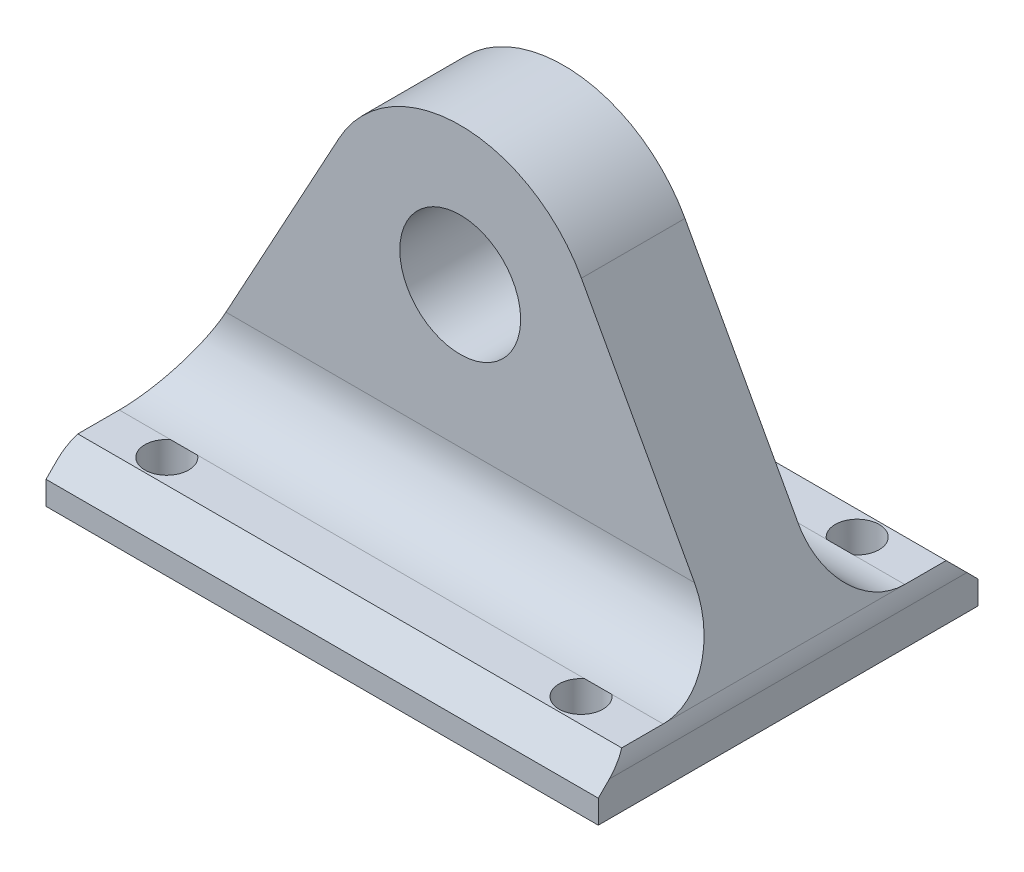
ISO-10303-21;
HEADER;
FILE_DESCRIPTION(('STEP AP214'),'2;1');
FILE_NAME('part.step','',(''),(''),'','','');
FILE_SCHEMA(('AUTOMOTIVE_DESIGN { 1 0 10303 214 1 1 1 1 }'));
ENDSEC;
DATA;
#1=APPLICATION_CONTEXT('core data for automotive mechanical design processes');
#2=APPLICATION_PROTOCOL_DEFINITION('international standard','automotive_design',2000,#1);
#3=PRODUCT_CONTEXT('',#1,'mechanical');
#4=PRODUCT('Part','Part','',(#3));
#5=PRODUCT_RELATED_PRODUCT_CATEGORY('part','',(#4));
#6=PRODUCT_DEFINITION_FORMATION('','',#4);
#7=PRODUCT_DEFINITION_CONTEXT('part definition',#1,'design');
#8=PRODUCT_DEFINITION('design','',#6,#7);
#9=PRODUCT_DEFINITION_SHAPE('','',#8);
#10=(LENGTH_UNIT() NAMED_UNIT(*) SI_UNIT(.MILLI.,.METRE.));
#11=(NAMED_UNIT(*) PLANE_ANGLE_UNIT() SI_UNIT($,.RADIAN.));
#12=(NAMED_UNIT(*) SI_UNIT($,.STERADIAN.) SOLID_ANGLE_UNIT());
#13=UNCERTAINTY_MEASURE_WITH_UNIT(LENGTH_MEASURE(1.E-05),#10,'distance_accuracy_value','');
#14=(GEOMETRIC_REPRESENTATION_CONTEXT(3) GLOBAL_UNCERTAINTY_ASSIGNED_CONTEXT((#13)) GLOBAL_UNIT_ASSIGNED_CONTEXT((#10,
#11,#12)) REPRESENTATION_CONTEXT('',''));
#15=CARTESIAN_POINT('',(0.,0.,0.));
#16=DIRECTION('',(0.,0.,1.));
#17=DIRECTION('',(1.,0.,0.));
#18=AXIS2_PLACEMENT_3D('',#15,#16,#17);
#19=CARTESIAN_POINT('',(47.23686332674,1.52118959964613,-12.7));
#20=DIRECTION('',(0.,-1.,0.));
#21=DIRECTION('',(1.,0.,0.));
#22=AXIS2_PLACEMENT_3D('',#19,#20,#21);
#23=PLANE('',#22);
#24=CARTESIAN_POINT('',(3.175,1.52118959964613,-7.93749999999999));
#25=DIRECTION('',(0.,1.,0.));
#26=DIRECTION('',(0.,0.,1.));
#27=AXIS2_PLACEMENT_3D('',#24,#25,#26);
#28=CIRCLE('',#27,2.0193);
#29=CARTESIAN_POINT('',(4.42296483924829,1.52118959964613,-6.35));
#30=VERTEX_POINT('',#29);
#31=CARTESIAN_POINT('',(1.9270351607517,1.52118959964613,-6.35));
#32=VERTEX_POINT('',#31);
#33=EDGE_CURVE('E60',#30,#32,#28,.T.);
#34=ORIENTED_EDGE('',*,*,#33,.F.);
#35=DIRECTION('',(1.,0.,0.));
#36=VECTOR('',#35,1.);
#37=CARTESIAN_POINT('',(47.23686332674,1.52118959964613,-6.35));
#38=LINE('',#37,#36);
#39=CARTESIAN_POINT('',(40.0270351607517,1.52118959964613,-6.35));
#40=VERTEX_POINT('',#39);
#41=EDGE_CURVE('E70',#30,#40,#38,.T.);
#42=ORIENTED_EDGE('',*,*,#41,.T.);
#43=CARTESIAN_POINT('',(41.275,1.52118959964613,-7.93749999999999));
#44=DIRECTION('',(0.,1.,0.));
#45=DIRECTION('',(0.,0.,1.));
#46=AXIS2_PLACEMENT_3D('',#43,#44,#45);
#47=CIRCLE('',#46,2.0193);
#48=CARTESIAN_POINT('',(42.5229648392483,1.52118959964613,-6.35));
#49=VERTEX_POINT('',#48);
#50=EDGE_CURVE('E386',#49,#40,#47,.T.);
#51=ORIENTED_EDGE('',*,*,#50,.F.);
#52=CARTESIAN_POINT('',(47.23686332674,1.52118959964613,-6.34999999999999));
#53=VERTEX_POINT('',#52);
#54=EDGE_CURVE('E214',#49,#53,#38,.T.);
#55=ORIENTED_EDGE('',*,*,#54,.T.);
#56=DIRECTION('',(0.,0.,1.));
#57=VECTOR('',#56,1.);
#58=CARTESIAN_POINT('',(47.23686332674,1.52118959964613,-12.7));
#59=LINE('',#58,#57);
#60=CARTESIAN_POINT('',(47.23686332674,1.52118959964613,-10.16));
#61=VERTEX_POINT('',#60);
#62=EDGE_CURVE('E384',#61,#53,#59,.T.);
#63=ORIENTED_EDGE('',*,*,#62,.F.);
#64=DIRECTION('',(-1.,0.,0.));
#65=VECTOR('',#64,1.);
#66=CARTESIAN_POINT('',(-2.78686332674002,1.52118959964613,-10.16));
#67=LINE('',#66,#65);
#68=CARTESIAN_POINT('',(-2.78686332674002,1.52118959964613,-10.16));
#69=VERTEX_POINT('',#68);
#70=EDGE_CURVE('E368',#61,#69,#67,.T.);
#71=ORIENTED_EDGE('',*,*,#70,.T.);
#72=DIRECTION('',(0.,0.,1.));
#73=VECTOR('',#72,1.);
#74=CARTESIAN_POINT('',(-2.78686332674002,1.52118959964613,-12.7));
#75=LINE('',#74,#73);
#76=CARTESIAN_POINT('',(-2.78686332674002,1.52118959964613,-6.35));
#77=VERTEX_POINT('',#76);
#78=EDGE_CURVE('E392',#69,#77,#75,.T.);
#79=ORIENTED_EDGE('',*,*,#78,.T.);
#80=EDGE_CURVE('E212',#77,#32,#38,.T.);
#81=ORIENTED_EDGE('',*,*,#80,.T.);
#82=EDGE_LOOP('',(#34,#42,#51,#55,#63,#71,#79,#81));
#83=FACE_BOUND('',#82,.T.);
#84=ADVANCED_FACE('F42',(#83),#23,.F.);
#85=CARTESIAN_POINT('',(-2.78686332674002,1.52118959964613,22.225));
#86=DIRECTION('',(0.,-1.,0.));
#87=DIRECTION('',(1.,0.,0.));
#88=AXIS2_PLACEMENT_3D('',#85,#86,#87);
#89=PLANE('',#88);
#90=DIRECTION('',(-1.,0.,0.));
#91=VECTOR('',#90,1.);
#92=CARTESIAN_POINT('',(-2.78686332674002,1.52118959964613,15.875));
#93=LINE('',#92,#91);
#94=CARTESIAN_POINT('',(47.23686332674,1.52118959964613,15.875));
#95=VERTEX_POINT('',#94);
#96=CARTESIAN_POINT('',(42.5229648392483,1.52118959964613,15.875));
#97=VERTEX_POINT('',#96);
#98=EDGE_CURVE('E248',#95,#97,#93,.T.);
#99=ORIENTED_EDGE('',*,*,#98,.T.);
#100=CARTESIAN_POINT('',(41.275,1.52118959964613,17.4625));
#101=DIRECTION('',(0.,1.,0.));
#102=DIRECTION('',(0.,0.,1.));
#103=AXIS2_PLACEMENT_3D('',#100,#101,#102);
#104=CIRCLE('',#103,2.0193);
#105=CARTESIAN_POINT('',(40.0270351607517,1.52118959964613,15.875));
#106=VERTEX_POINT('',#105);
#107=EDGE_CURVE('E499',#106,#97,#104,.T.);
#108=ORIENTED_EDGE('',*,*,#107,.F.);
#109=CARTESIAN_POINT('',(4.42296483924828,1.52118959964613,15.875));
#110=VERTEX_POINT('',#109);
#111=EDGE_CURVE('E253',#106,#110,#93,.T.);
#112=ORIENTED_EDGE('',*,*,#111,.T.);
#113=CARTESIAN_POINT('',(3.175,1.52118959964613,17.4625));
#114=DIRECTION('',(0.,1.,0.));
#115=DIRECTION('',(0.,0.,1.));
#116=AXIS2_PLACEMENT_3D('',#113,#114,#115);
#117=CIRCLE('',#116,2.0193);
#118=CARTESIAN_POINT('',(1.92703516075172,1.52118959964613,15.875));
#119=VERTEX_POINT('',#118);
#120=EDGE_CURVE('E508',#119,#110,#117,.T.);
#121=ORIENTED_EDGE('',*,*,#120,.F.);
#122=CARTESIAN_POINT('',(-2.78686332674002,1.52118959964613,15.875));
#123=VERTEX_POINT('',#122);
#124=EDGE_CURVE('E237',#119,#123,#93,.T.);
#125=ORIENTED_EDGE('',*,*,#124,.T.);
#126=DIRECTION('',(0.,0.,-1.));
#127=VECTOR('',#126,1.);
#128=CARTESIAN_POINT('',(-2.78686332674002,1.52118959964613,22.225));
#129=LINE('',#128,#127);
#130=CARTESIAN_POINT('',(-2.78686332674002,1.52118959964613,19.685));
#131=VERTEX_POINT('',#130);
#132=EDGE_CURVE('E411',#131,#123,#129,.T.);
#133=ORIENTED_EDGE('',*,*,#132,.F.);
#134=DIRECTION('',(1.,0.,0.));
#135=VECTOR('',#134,1.);
#136=CARTESIAN_POINT('',(47.23686332674,1.52118959964613,19.685));
#137=LINE('',#136,#135);
#138=CARTESIAN_POINT('',(47.23686332674,1.52118959964613,19.685));
#139=VERTEX_POINT('',#138);
#140=EDGE_CURVE('E349',#131,#139,#137,.T.);
#141=ORIENTED_EDGE('',*,*,#140,.T.);
#142=DIRECTION('',(0.,0.,-1.));
#143=VECTOR('',#142,1.);
#144=CARTESIAN_POINT('',(47.23686332674,1.52118959964613,22.225));
#145=LINE('',#144,#143);
#146=EDGE_CURVE('E414',#139,#95,#145,.T.);
#147=ORIENTED_EDGE('',*,*,#146,.T.);
#148=EDGE_LOOP('',(#99,#108,#112,#121,#125,#133,#141,#147));
#149=FACE_BOUND('',#148,.T.);
#150=ADVANCED_FACE('F443',(#149),#89,.F.);
#151=CARTESIAN_POINT('',(44.45,0.,0.));
#152=DIRECTION('',(0.,0.,1.));
#153=DIRECTION('',(1.,0.,0.));
#154=AXIS2_PLACEMENT_3D('',#151,#152,#153);
#155=PLANE('',#154);
#156=CARTESIAN_POINT('',(22.225,20.8364312010616,0.));
#157=DIRECTION('',(0.,0.,1.));
#158=DIRECTION('',(1.,0.,0.));
#159=AXIS2_PLACEMENT_3D('',#156,#157,#158);
#160=CIRCLE('',#159,5.55625);
#161=CARTESIAN_POINT('',(16.66875,20.8364312010616,0.));
#162=VERTEX_POINT('',#161);
#163=EDGE_CURVE('E309',#162,#162,#160,.T.);
#164=ORIENTED_EDGE('',*,*,#163,.T.);
#165=EDGE_LOOP('',(#164));
#166=FACE_BOUND('',#165,.T.);
#167=DIRECTION('',(-0.479114834534213,0.877752228894495,0.));
#168=VECTOR('',#167,1.);
#169=CARTESIAN_POINT('',(33.3724533069601,26.9211895996461,0.));
#170=LINE('',#169,#168);
#171=CARTESIAN_POINT('',(43.770760821795,7.87118959964613,0.));
#172=VERTEX_POINT('',#171);
#173=CARTESIAN_POINT('',(33.3724533069601,26.9211895996461,0.));
#174=VERTEX_POINT('',#173);
#175=EDGE_CURVE('E312',#172,#174,#170,.T.);
#176=ORIENTED_EDGE('',*,*,#175,.F.);
#177=DIRECTION('',(1.,0.,0.));
#178=VECTOR('',#177,1.);
#179=CARTESIAN_POINT('',(-2.78686332674002,7.87118959964612,0.));
#180=LINE('',#179,#178);
#181=CARTESIAN_POINT('',(0.679239178204961,7.87118959964612,0.));
#182=VERTEX_POINT('',#181);
#183=EDGE_CURVE('E233',#172,#182,#180,.F.);
#184=ORIENTED_EDGE('',*,*,#183,.T.);
#185=DIRECTION('',(-0.479114834534213,-0.877752228894495,0.));
#186=VECTOR('',#185,1.);
#187=CARTESIAN_POINT('',(-2.78686332674002,1.52118959964613,0.));
#188=LINE('',#187,#186);
#189=CARTESIAN_POINT('',(11.0775466930399,26.9211895996461,0.));
#190=VERTEX_POINT('',#189);
#191=EDGE_CURVE('E300',#190,#182,#188,.T.);
#192=ORIENTED_EDGE('',*,*,#191,.F.);
#193=CARTESIAN_POINT('',(22.225,20.8364312010616,0.));
#194=DIRECTION('',(0.,0.,1.));
#195=DIRECTION('',(1.,0.,0.));
#196=AXIS2_PLACEMENT_3D('',#193,#194,#195);
#197=CIRCLE('',#196,12.7);
#198=EDGE_CURVE('E306',#174,#190,#197,.T.);
#199=ORIENTED_EDGE('',*,*,#198,.F.);
#200=EDGE_LOOP('',(#176,#184,#192,#199));
#201=FACE_BOUND('',#200,.T.);
#202=ADVANCED_FACE('F423',(#166,#201),#155,.F.);
#203=CARTESIAN_POINT('',(44.45,0.,9.525));
#204=DIRECTION('',(0.,0.,1.));
#205=DIRECTION('',(1.,0.,0.));
#206=AXIS2_PLACEMENT_3D('',#203,#204,#205);
#207=PLANE('',#206);
#208=DIRECTION('',(-0.479114834534213,-0.877752228894495,0.));
#209=VECTOR('',#208,1.);
#210=CARTESIAN_POINT('',(-2.78686332674002,1.52118959964613,9.525));
#211=LINE('',#210,#209);
#212=CARTESIAN_POINT('',(11.0775466930399,26.9211895996461,9.525));
#213=VERTEX_POINT('',#212);
#214=CARTESIAN_POINT('',(0.679239178204961,7.87118959964612,9.525));
#215=VERTEX_POINT('',#214);
#216=EDGE_CURVE('E271',#213,#215,#211,.T.);
#217=ORIENTED_EDGE('',*,*,#216,.T.);
#218=DIRECTION('',(-1.,0.,0.));
#219=VECTOR('',#218,1.);
#220=CARTESIAN_POINT('',(44.45,7.87118959964612,9.525));
#221=LINE('',#220,#219);
#222=CARTESIAN_POINT('',(43.770760821795,7.87118959964613,9.525));
#223=VERTEX_POINT('',#222);
#224=EDGE_CURVE('E252',#215,#223,#221,.F.);
#225=ORIENTED_EDGE('',*,*,#224,.T.);
#226=DIRECTION('',(-0.479114834534213,0.877752228894495,0.));
#227=VECTOR('',#226,1.);
#228=CARTESIAN_POINT('',(33.3724533069601,26.9211895996461,9.525));
#229=LINE('',#228,#227);
#230=CARTESIAN_POINT('',(33.3724533069601,26.9211895996461,9.525));
#231=VERTEX_POINT('',#230);
#232=EDGE_CURVE('E296',#223,#231,#229,.T.);
#233=ORIENTED_EDGE('',*,*,#232,.T.);
#234=CARTESIAN_POINT('',(22.225,20.8364312010616,9.525));
#235=DIRECTION('',(0.,0.,1.));
#236=DIRECTION('',(1.,0.,0.));
#237=AXIS2_PLACEMENT_3D('',#234,#235,#236);
#238=CIRCLE('',#237,12.7);
#239=EDGE_CURVE('E282',#231,#213,#238,.T.);
#240=ORIENTED_EDGE('',*,*,#239,.T.);
#241=EDGE_LOOP('',(#217,#225,#233,#240));
#242=FACE_BOUND('',#241,.T.);
#243=CARTESIAN_POINT('',(22.225,20.8364312010616,9.525));
#244=DIRECTION('',(0.,0.,1.));
#245=DIRECTION('',(1.,0.,0.));
#246=AXIS2_PLACEMENT_3D('',#243,#244,#245);
#247=CIRCLE('',#246,5.55625);
#248=CARTESIAN_POINT('',(16.66875,20.8364312010616,9.525));
#249=VERTEX_POINT('',#248);
#250=EDGE_CURVE('E314',#249,#249,#247,.T.);
#251=ORIENTED_EDGE('',*,*,#250,.F.);
#252=EDGE_LOOP('',(#251));
#253=FACE_BOUND('',#252,.T.);
#254=ADVANCED_FACE('F278',(#242,#253),#207,.T.);
#255=CARTESIAN_POINT('',(44.45,0.,9.525));
#256=DIRECTION('',(0.,0.,-1.));
#257=DIRECTION('',(-1.,0.,0.));
#258=AXIS2_PLACEMENT_3D('',#255,#256,#257);
#259=CYLINDRICAL_SURFACE('',#258,3.175);
#260=DIRECTION('',(0.,0.,-1.));
#261=VECTOR('',#260,1.);
#262=CARTESIAN_POINT('',(47.625,0.,9.525));
#263=LINE('',#262,#261);
#264=CARTESIAN_POINT('',(47.625,0.,21.2061895996461));
#265=VERTEX_POINT('',#264);
#266=CARTESIAN_POINT('',(47.625,0.,-11.6811895996461));
#267=VERTEX_POINT('',#266);
#268=EDGE_CURVE('E285',#265,#267,#263,.T.);
#269=ORIENTED_EDGE('',*,*,#268,.T.);
#270=CARTESIAN_POINT('',(44.45,0.,-11.6811895996461));
#271=DIRECTION('',(0.,0.707106781186549,-0.707106781186546));
#272=DIRECTION('',(0.,-0.707106781186546,-0.707106781186549));
#273=AXIS2_PLACEMENT_3D('',#270,#271,#272);
#274=ELLIPSE('',#273,4.49012806053459,3.175);
#275=EDGE_CURVE('E365',#267,#61,#274,.F.);
#276=ORIENTED_EDGE('',*,*,#275,.T.);
#277=ORIENTED_EDGE('',*,*,#62,.T.);
#278=DIRECTION('',(0.,0.,-1.));
#279=VECTOR('',#278,1.);
#280=CARTESIAN_POINT('',(47.23686332674,1.52118959964613,9.525));
#281=LINE('',#280,#279);
#282=EDGE_CURVE('E293',#95,#53,#281,.T.);
#283=ORIENTED_EDGE('',*,*,#282,.F.);
#284=ORIENTED_EDGE('',*,*,#146,.F.);
#285=CARTESIAN_POINT('',(44.45,0.,21.2061895996461));
#286=DIRECTION('',(0.,0.707106781186549,0.707106781186546));
#287=DIRECTION('',(0.,0.707106781186546,-0.707106781186549));
#288=AXIS2_PLACEMENT_3D('',#285,#286,#287);
#289=ELLIPSE('',#288,4.49012806053459,3.175);
#290=EDGE_CURVE('E352',#139,#265,#289,.F.);
#291=ORIENTED_EDGE('',*,*,#290,.T.);
#292=EDGE_LOOP('',(#269,#276,#277,#283,#284,#291));
#293=FACE_BOUND('',#292,.T.);
#294=ADVANCED_FACE('F388',(#293),#259,.T.);
#295=CARTESIAN_POINT('',(33.3724533069601,26.9211895996461,9.525));
#296=DIRECTION('',(-0.877752228894495,-0.479114834534213,0.));
#297=DIRECTION('',(0.479114834534213,-0.877752228894495,0.));
#298=AXIS2_PLACEMENT_3D('',#295,#296,#297);
#299=PLANE('',#298);
#300=ORIENTED_EDGE('',*,*,#282,.T.);
#301=CARTESIAN_POINT('',(43.770760821795,7.87118959964612,-6.35));
#302=DIRECTION('',(-0.877752228894495,-0.479114834534213,0.));
#303=DIRECTION('',(-0.479114834534213,0.877752228894495,0.));
#304=AXIS2_PLACEMENT_3D('',#301,#302,#303);
#305=ELLIPSE('',#304,7.23438778161538,6.35);
#306=EDGE_CURVE('E256',#53,#172,#305,.T.);
#307=ORIENTED_EDGE('',*,*,#306,.T.);
#308=ORIENTED_EDGE('',*,*,#175,.T.);
#309=DIRECTION('',(0.,0.,-1.));
#310=VECTOR('',#309,1.);
#311=CARTESIAN_POINT('',(33.3724533069601,26.9211895996461,9.525));
#312=LINE('',#311,#310);
#313=EDGE_CURVE('E298',#231,#174,#312,.T.);
#314=ORIENTED_EDGE('',*,*,#313,.F.);
#315=ORIENTED_EDGE('',*,*,#232,.F.);
#316=CARTESIAN_POINT('',(43.770760821795,7.87118959964612,15.875));
#317=DIRECTION('',(-0.877752228894495,-0.479114834534213,0.));
#318=DIRECTION('',(-0.479114834534213,0.877752228894495,0.));
#319=AXIS2_PLACEMENT_3D('',#316,#317,#318);
#320=ELLIPSE('',#319,7.23438778161538,6.35);
#321=EDGE_CURVE('E11',#223,#95,#320,.T.);
#322=ORIENTED_EDGE('',*,*,#321,.T.);
#323=EDGE_LOOP('',(#300,#307,#308,#314,#315,#322));
#324=FACE_BOUND('',#323,.T.);
#325=ADVANCED_FACE('F292',(#324),#299,.F.);
#326=CARTESIAN_POINT('',(22.225,20.8364312010616,9.525));
#327=DIRECTION('',(0.,0.,-1.));
#328=DIRECTION('',(-1.,0.,0.));
#329=AXIS2_PLACEMENT_3D('',#326,#327,#328);
#330=CYLINDRICAL_SURFACE('',#329,12.7);
#331=ORIENTED_EDGE('',*,*,#198,.T.);
#332=DIRECTION('',(0.,0.,-1.));
#333=VECTOR('',#332,1.);
#334=CARTESIAN_POINT('',(11.0775466930399,26.9211895996461,9.525));
#335=LINE('',#334,#333);
#336=EDGE_CURVE('E332',#213,#190,#335,.T.);
#337=ORIENTED_EDGE('',*,*,#336,.F.);
#338=ORIENTED_EDGE('',*,*,#239,.F.);
#339=ORIENTED_EDGE('',*,*,#313,.T.);
#340=EDGE_LOOP('',(#331,#337,#338,#339));
#341=FACE_BOUND('',#340,.T.);
#342=ADVANCED_FACE('F548',(#341),#330,.T.);
#343=CARTESIAN_POINT('',(-2.78686332674002,1.52118959964613,9.525));
#344=DIRECTION('',(0.877752228894495,-0.479114834534213,0.));
#345=DIRECTION('',(0.479114834534213,0.877752228894495,0.));
#346=AXIS2_PLACEMENT_3D('',#343,#344,#345);
#347=PLANE('',#346);
#348=ORIENTED_EDGE('',*,*,#191,.T.);
#349=CARTESIAN_POINT('',(0.679239178204963,7.87118959964612,-6.35));
#350=DIRECTION('',(0.877752228894495,-0.479114834534213,0.));
#351=DIRECTION('',(-0.479114834534213,-0.877752228894495,0.));
#352=AXIS2_PLACEMENT_3D('',#349,#350,#351);
#353=ELLIPSE('',#352,7.23438778161538,6.35);
#354=EDGE_CURVE('E259',#182,#77,#353,.T.);
#355=ORIENTED_EDGE('',*,*,#354,.T.);
#356=DIRECTION('',(0.,0.,-1.));
#357=VECTOR('',#356,1.);
#358=CARTESIAN_POINT('',(-2.78686332674002,1.52118959964613,9.525));
#359=LINE('',#358,#357);
#360=EDGE_CURVE('E272',#123,#77,#359,.T.);
#361=ORIENTED_EDGE('',*,*,#360,.F.);
#362=CARTESIAN_POINT('',(0.679239178204961,7.87118959964612,15.875));
#363=DIRECTION('',(0.877752228894495,-0.479114834534213,0.));
#364=DIRECTION('',(-0.479114834534213,-0.877752228894495,0.));
#365=AXIS2_PLACEMENT_3D('',#362,#363,#364);
#366=ELLIPSE('',#365,7.23438778161538,6.35);
#367=EDGE_CURVE('E51',#123,#215,#366,.T.);
#368=ORIENTED_EDGE('',*,*,#367,.T.);
#369=ORIENTED_EDGE('',*,*,#216,.F.);
#370=ORIENTED_EDGE('',*,*,#336,.T.);
#371=EDGE_LOOP('',(#348,#355,#361,#368,#369,#370));
#372=FACE_BOUND('',#371,.T.);
#373=ADVANCED_FACE('F269',(#372),#347,.F.);
#374=CARTESIAN_POINT('',(0.,0.,9.525));
#375=DIRECTION('',(0.,0.,-1.));
#376=DIRECTION('',(-1.,0.,0.));
#377=AXIS2_PLACEMENT_3D('',#374,#375,#376);
#378=CYLINDRICAL_SURFACE('',#377,3.175);
#379=ORIENTED_EDGE('',*,*,#78,.F.);
#380=CARTESIAN_POINT('',(0.,0.,-11.6811895996461));
#381=DIRECTION('',(0.,0.707106781186549,-0.707106781186546));
#382=DIRECTION('',(0.,-0.707106781186546,-0.707106781186549));
#383=AXIS2_PLACEMENT_3D('',#380,#381,#382);
#384=ELLIPSE('',#383,4.49012806053459,3.175);
#385=CARTESIAN_POINT('',(-3.175,0.,-11.6811895996461));
#386=VERTEX_POINT('',#385);
#387=EDGE_CURVE('E371',#69,#386,#384,.F.);
#388=ORIENTED_EDGE('',*,*,#387,.T.);
#389=DIRECTION('',(0.,0.,-1.));
#390=VECTOR('',#389,1.);
#391=CARTESIAN_POINT('',(-3.175,0.,9.525));
#392=LINE('',#391,#390);
#393=CARTESIAN_POINT('',(-3.175,0.,21.2061895996461));
#394=VERTEX_POINT('',#393);
#395=EDGE_CURVE('E327',#394,#386,#392,.T.);
#396=ORIENTED_EDGE('',*,*,#395,.F.);
#397=CARTESIAN_POINT('',(0.,0.,21.2061895996461));
#398=DIRECTION('',(0.,0.707106781186549,0.707106781186546));
#399=DIRECTION('',(0.,0.707106781186546,-0.707106781186549));
#400=AXIS2_PLACEMENT_3D('',#397,#398,#399);
#401=ELLIPSE('',#400,4.49012806053459,3.175);
#402=EDGE_CURVE('E346',#394,#131,#401,.F.);
#403=ORIENTED_EDGE('',*,*,#402,.T.);
#404=ORIENTED_EDGE('',*,*,#132,.T.);
#405=ORIENTED_EDGE('',*,*,#360,.T.);
#406=EDGE_LOOP('',(#379,#388,#396,#403,#404,#405));
#407=FACE_BOUND('',#406,.T.);
#408=ADVANCED_FACE('F540',(#407),#378,.T.);
#409=CARTESIAN_POINT('',(-3.175,0.,9.525));
#410=DIRECTION('',(1.,0.,0.));
#411=DIRECTION('',(0.,1.,0.));
#412=AXIS2_PLACEMENT_3D('',#409,#410,#411);
#413=PLANE('',#412);
#414=ORIENTED_EDGE('',*,*,#395,.T.);
#415=DIRECTION('',(0.,-0.707106781186546,-0.707106781186549));
#416=VECTOR('',#415,1.);
#417=CARTESIAN_POINT('',(-3.175,-1.01881040035388,-12.7));
#418=LINE('',#417,#416);
#419=CARTESIAN_POINT('',(-3.175,-1.01881040035387,-12.7));
#420=VERTEX_POINT('',#419);
#421=EDGE_CURVE('E373',#386,#420,#418,.T.);
#422=ORIENTED_EDGE('',*,*,#421,.T.);
#423=DIRECTION('',(0.,1.,0.));
#424=VECTOR('',#423,1.);
#425=CARTESIAN_POINT('',(-3.175,0.,-12.7));
#426=LINE('',#425,#424);
#427=CARTESIAN_POINT('',(-3.175,-3.175,-12.7));
#428=VERTEX_POINT('',#427);
#429=EDGE_CURVE('E393',#428,#420,#426,.T.);
#430=ORIENTED_EDGE('',*,*,#429,.F.);
#431=DIRECTION('',(0.,0.,-1.));
#432=VECTOR('',#431,1.);
#433=CARTESIAN_POINT('',(-3.175,-3.175,9.525));
#434=LINE('',#433,#432);
#435=CARTESIAN_POINT('',(-3.175,-3.175,22.225));
#436=VERTEX_POINT('',#435);
#437=EDGE_CURVE('E324',#436,#428,#434,.T.);
#438=ORIENTED_EDGE('',*,*,#437,.F.);
#439=DIRECTION('',(0.,-1.,0.));
#440=VECTOR('',#439,1.);
#441=CARTESIAN_POINT('',(-3.175,0.,22.225));
#442=LINE('',#441,#440);
#443=CARTESIAN_POINT('',(-3.175,-1.01881040035387,22.225));
#444=VERTEX_POINT('',#443);
#445=EDGE_CURVE('E395',#444,#436,#442,.T.);
#446=ORIENTED_EDGE('',*,*,#445,.F.);
#447=DIRECTION('',(0.,0.707106781186546,-0.707106781186549));
#448=VECTOR('',#447,1.);
#449=CARTESIAN_POINT('',(-3.175,-1.01881040035388,22.225));
#450=LINE('',#449,#448);
#451=EDGE_CURVE('E343',#444,#394,#450,.T.);
#452=ORIENTED_EDGE('',*,*,#451,.T.);
#453=EDGE_LOOP('',(#414,#422,#430,#438,#446,#452));
#454=FACE_BOUND('',#453,.T.);
#455=ADVANCED_FACE('F526',(#454),#413,.F.);
#456=CARTESIAN_POINT('',(47.625,-3.175,9.525));
#457=DIRECTION('',(0.,1.,0.));
#458=DIRECTION('',(0.,0.,1.));
#459=AXIS2_PLACEMENT_3D('',#456,#457,#458);
#460=PLANE('',#459);
#461=CARTESIAN_POINT('',(3.175,-3.175,-7.93749999999999));
#462=DIRECTION('',(0.,1.,0.));
#463=DIRECTION('',(0.,0.,1.));
#464=AXIS2_PLACEMENT_3D('',#461,#462,#463);
#465=CIRCLE('',#464,2.0193);
#466=CARTESIAN_POINT('',(3.175,-3.175,-5.91819999999999));
#467=VERTEX_POINT('',#466);
#468=EDGE_CURVE('E220',#467,#467,#465,.T.);
#469=ORIENTED_EDGE('',*,*,#468,.T.);
#470=EDGE_LOOP('',(#469));
#471=FACE_BOUND('',#470,.T.);
#472=CARTESIAN_POINT('',(41.275,-3.175,-7.93749999999999));
#473=DIRECTION('',(0.,1.,0.));
#474=DIRECTION('',(0.,0.,1.));
#475=AXIS2_PLACEMENT_3D('',#472,#473,#474);
#476=CIRCLE('',#475,2.0193);
#477=CARTESIAN_POINT('',(41.275,-3.175,-5.91819999999999));
#478=VERTEX_POINT('',#477);
#479=EDGE_CURVE('E495',#478,#478,#476,.T.);
#480=ORIENTED_EDGE('',*,*,#479,.T.);
#481=EDGE_LOOP('',(#480));
#482=FACE_BOUND('',#481,.T.);
#483=CARTESIAN_POINT('',(41.275,-3.175,17.4625));
#484=DIRECTION('',(0.,1.,0.));
#485=DIRECTION('',(0.,0.,1.));
#486=AXIS2_PLACEMENT_3D('',#483,#484,#485);
#487=CIRCLE('',#486,2.0193);
#488=CARTESIAN_POINT('',(41.275,-3.175,19.4818));
#489=VERTEX_POINT('',#488);
#490=EDGE_CURVE('E504',#489,#489,#487,.T.);
#491=ORIENTED_EDGE('',*,*,#490,.T.);
#492=EDGE_LOOP('',(#491));
#493=FACE_BOUND('',#492,.T.);
#494=CARTESIAN_POINT('',(3.175,-3.175,17.4625));
#495=DIRECTION('',(0.,1.,0.));
#496=DIRECTION('',(0.,0.,1.));
#497=AXIS2_PLACEMENT_3D('',#494,#495,#496);
#498=CIRCLE('',#497,2.0193);
#499=CARTESIAN_POINT('',(3.175,-3.175,19.4818));
#500=VERTEX_POINT('',#499);
#501=EDGE_CURVE('E513',#500,#500,#498,.T.);
#502=ORIENTED_EDGE('',*,*,#501,.T.);
#503=EDGE_LOOP('',(#502));
#504=FACE_BOUND('',#503,.T.);
#505=ORIENTED_EDGE('',*,*,#437,.T.);
#506=DIRECTION('',(-1.,0.,0.));
#507=VECTOR('',#506,1.);
#508=CARTESIAN_POINT('',(-3.175,-3.175,-12.7));
#509=LINE('',#508,#507);
#510=CARTESIAN_POINT('',(47.625,-3.175,-12.7));
#511=VERTEX_POINT('',#510);
#512=EDGE_CURVE('E397',#511,#428,#509,.T.);
#513=ORIENTED_EDGE('',*,*,#512,.F.);
#514=DIRECTION('',(0.,0.,-1.));
#515=VECTOR('',#514,1.);
#516=CARTESIAN_POINT('',(47.625,-3.175,9.525));
#517=LINE('',#516,#515);
#518=CARTESIAN_POINT('',(47.625,-3.175,22.225));
#519=VERTEX_POINT('',#518);
#520=EDGE_CURVE('E320',#519,#511,#517,.T.);
#521=ORIENTED_EDGE('',*,*,#520,.F.);
#522=DIRECTION('',(1.,0.,0.));
#523=VECTOR('',#522,1.);
#524=CARTESIAN_POINT('',(-3.175,-3.175,22.225));
#525=LINE('',#524,#523);
#526=EDGE_CURVE('E403',#436,#519,#525,.T.);
#527=ORIENTED_EDGE('',*,*,#526,.F.);
#528=EDGE_LOOP('',(#505,#513,#521,#527));
#529=FACE_BOUND('',#528,.T.);
#530=ADVANCED_FACE('F437',(#471,#482,#493,#504,#529),#460,.F.);
#531=CARTESIAN_POINT('',(47.625,0.,9.525));
#532=DIRECTION('',(-1.,0.,0.));
#533=DIRECTION('',(0.,-1.,0.));
#534=AXIS2_PLACEMENT_3D('',#531,#532,#533);
#535=PLANE('',#534);
#536=DIRECTION('',(0.,-1.,0.));
#537=VECTOR('',#536,1.);
#538=CARTESIAN_POINT('',(47.625,-3.175,-12.7));
#539=LINE('',#538,#537);
#540=CARTESIAN_POINT('',(47.625,-1.01881040035388,-12.7));
#541=VERTEX_POINT('',#540);
#542=EDGE_CURVE('E517',#541,#511,#539,.T.);
#543=ORIENTED_EDGE('',*,*,#542,.F.);
#544=DIRECTION('',(0.,0.707106781186546,0.707106781186549));
#545=VECTOR('',#544,1.);
#546=CARTESIAN_POINT('',(47.625,-1.01881040035393,-12.7000000000001));
#547=LINE('',#546,#545);
#548=EDGE_CURVE('E362',#541,#267,#547,.T.);
#549=ORIENTED_EDGE('',*,*,#548,.T.);
#550=ORIENTED_EDGE('',*,*,#268,.F.);
#551=DIRECTION('',(0.,-0.707106781186546,0.707106781186549));
#552=VECTOR('',#551,1.);
#553=CARTESIAN_POINT('',(47.625,-1.01881040035388,22.225));
#554=LINE('',#553,#552);
#555=CARTESIAN_POINT('',(47.625,-1.01881040035388,22.225));
#556=VERTEX_POINT('',#555);
#557=EDGE_CURVE('E355',#265,#556,#554,.T.);
#558=ORIENTED_EDGE('',*,*,#557,.T.);
#559=DIRECTION('',(0.,1.,0.));
#560=VECTOR('',#559,1.);
#561=CARTESIAN_POINT('',(47.625,-3.175,22.225));
#562=LINE('',#561,#560);
#563=EDGE_CURVE('E407',#519,#556,#562,.T.);
#564=ORIENTED_EDGE('',*,*,#563,.F.);
#565=ORIENTED_EDGE('',*,*,#520,.T.);
#566=EDGE_LOOP('',(#543,#549,#550,#558,#564,#565));
#567=FACE_BOUND('',#566,.T.);
#568=ADVANCED_FACE('F428',(#567),#535,.F.);
#569=CARTESIAN_POINT('',(22.225,20.8364312010616,9.525));
#570=DIRECTION('',(0.,0.,-1.));
#571=DIRECTION('',(-1.,0.,0.));
#572=AXIS2_PLACEMENT_3D('',#569,#570,#571);
#573=CYLINDRICAL_SURFACE('',#572,5.55625);
#574=CARTESIAN_POINT('',(16.66875,20.8364312010616,9.525));
#575=CARTESIAN_POINT('',(16.66875,20.8364312010616,9.42578125));
#576=CARTESIAN_POINT('',(16.66875,20.8364312010616,9.3265625));
#577=CARTESIAN_POINT('',(16.66875,20.8364312010616,9.128125));
#578=CARTESIAN_POINT('',(16.66875,20.8364312010616,9.02890625));
#579=CARTESIAN_POINT('',(16.66875,20.8364312010616,8.83046875));
#580=CARTESIAN_POINT('',(16.66875,20.8364312010616,8.73125));
#581=CARTESIAN_POINT('',(16.66875,20.8364312010616,8.5328125));
#582=CARTESIAN_POINT('',(16.66875,20.8364312010616,8.43359375));
#583=CARTESIAN_POINT('',(16.66875,20.8364312010616,8.23515625));
#584=CARTESIAN_POINT('',(16.66875,20.8364312010616,8.1359375));
#585=CARTESIAN_POINT('',(16.66875,20.8364312010616,7.9375));
#586=CARTESIAN_POINT('',(16.66875,20.8364312010616,7.83828125));
#587=CARTESIAN_POINT('',(16.66875,20.8364312010616,7.63984375));
#588=CARTESIAN_POINT('',(16.66875,20.8364312010616,7.540625));
#589=CARTESIAN_POINT('',(16.66875,20.8364312010616,7.3421875));
#590=CARTESIAN_POINT('',(16.66875,20.8364312010616,7.24296875));
#591=CARTESIAN_POINT('',(16.66875,20.8364312010616,7.04453125));
#592=CARTESIAN_POINT('',(16.66875,20.8364312010616,6.9453125));
#593=CARTESIAN_POINT('',(16.66875,20.8364312010616,6.746875));
#594=CARTESIAN_POINT('',(16.66875,20.8364312010616,6.64765625));
#595=CARTESIAN_POINT('',(16.66875,20.8364312010616,6.44921875));
#596=CARTESIAN_POINT('',(16.66875,20.8364312010616,6.35));
#597=CARTESIAN_POINT('',(16.66875,20.8364312010616,6.1515625));
#598=CARTESIAN_POINT('',(16.66875,20.8364312010616,6.05234375));
#599=CARTESIAN_POINT('',(16.66875,20.8364312010616,5.85390625));
#600=CARTESIAN_POINT('',(16.66875,20.8364312010616,5.7546875));
#601=CARTESIAN_POINT('',(16.66875,20.8364312010616,5.55625));
#602=CARTESIAN_POINT('',(16.66875,20.8364312010616,5.45703125));
#603=CARTESIAN_POINT('',(16.66875,20.8364312010616,5.25859375));
#604=CARTESIAN_POINT('',(16.66875,20.8364312010616,5.159375));
#605=CARTESIAN_POINT('',(16.66875,20.8364312010616,4.9609375));
#606=CARTESIAN_POINT('',(16.66875,20.8364312010616,4.86171875));
#607=CARTESIAN_POINT('',(16.66875,20.8364312010616,4.66328125));
#608=CARTESIAN_POINT('',(16.66875,20.8364312010616,4.5640625));
#609=CARTESIAN_POINT('',(16.66875,20.8364312010616,4.365625));
#610=CARTESIAN_POINT('',(16.66875,20.8364312010616,4.26640625));
#611=CARTESIAN_POINT('',(16.66875,20.8364312010616,4.06796875));
#612=CARTESIAN_POINT('',(16.66875,20.8364312010616,3.96875));
#613=CARTESIAN_POINT('',(16.66875,20.8364312010616,3.7703125));
#614=CARTESIAN_POINT('',(16.66875,20.8364312010616,3.67109375));
#615=CARTESIAN_POINT('',(16.66875,20.8364312010616,3.47265625));
#616=CARTESIAN_POINT('',(16.66875,20.8364312010616,3.3734375));
#617=CARTESIAN_POINT('',(16.66875,20.8364312010616,3.175));
#618=CARTESIAN_POINT('',(16.66875,20.8364312010616,3.07578125));
#619=CARTESIAN_POINT('',(16.66875,20.8364312010616,2.87734375));
#620=CARTESIAN_POINT('',(16.66875,20.8364312010616,2.778125));
#621=CARTESIAN_POINT('',(16.66875,20.8364312010616,2.5796875));
#622=CARTESIAN_POINT('',(16.66875,20.8364312010616,2.48046875));
#623=CARTESIAN_POINT('',(16.66875,20.8364312010616,2.28203125));
#624=CARTESIAN_POINT('',(16.66875,20.8364312010616,2.1828125));
#625=CARTESIAN_POINT('',(16.66875,20.8364312010616,1.984375));
#626=CARTESIAN_POINT('',(16.66875,20.8364312010616,1.88515625));
#627=CARTESIAN_POINT('',(16.66875,20.8364312010616,1.68671875));
#628=CARTESIAN_POINT('',(16.66875,20.8364312010616,1.5875));
#629=CARTESIAN_POINT('',(16.66875,20.8364312010616,1.3890625));
#630=CARTESIAN_POINT('',(16.66875,20.8364312010616,1.28984375));
#631=CARTESIAN_POINT('',(16.66875,20.8364312010616,1.09140625));
#632=CARTESIAN_POINT('',(16.66875,20.8364312010616,0.992187500000001));
#633=CARTESIAN_POINT('',(16.66875,20.8364312010616,0.793750000000001));
#634=CARTESIAN_POINT('',(16.66875,20.8364312010616,0.69453125));
#635=CARTESIAN_POINT('',(16.66875,20.8364312010616,0.49609375));
#636=CARTESIAN_POINT('',(16.66875,20.8364312010616,0.396875));
#637=CARTESIAN_POINT('',(16.66875,20.8364312010616,0.1984375));
#638=CARTESIAN_POINT('',(16.66875,20.8364312010616,0.0992187500000001));
#639=CARTESIAN_POINT('',(16.66875,20.8364312010616,0.));
#640=B_SPLINE_CURVE_WITH_KNOTS('',3,(#574,#575,#576,#577,#578,#579,#580,#581,#582,#583,#584,
#585,#586,#587,#588,#589,#590,#591,#592,#593,#594,#595,#596,#597,#598,#599,#600,#601,#602,#603,
#604,#605,#606,#607,#608,#609,#610,#611,#612,#613,#614,#615,#616,#617,#618,#619,#620,#621,#622,
#623,#624,#625,#626,#627,#628,#629,#630,#631,#632,#633,#634,#635,#636,#637,#638,#639),
.UNSPECIFIED.,.F.,.F.,(4,2,2,2,2,2,2,2,2,2,2,2,2,2,2,2,2,2,2,2,2,2,2,2,2,2,2,2,2,2,2,2,4),(0.,
0.29765625,0.5953125,0.892968750000001,1.190625,1.48828125,1.7859375,2.08359375,2.38125,
2.67890625,2.9765625,3.27421875,3.571875,3.86953125,4.1671875,4.46484375,4.7625,5.06015625,
5.3578125,5.65546875,5.953125,6.25078125,6.5484375,6.84609375,7.14375,7.44140625,7.7390625,
8.03671875,8.334375,8.63203125,8.9296875,9.22734375,9.525),.UNSPECIFIED.);
#641=EDGE_CURVE('BSEAM425',#249,#162,#640,.T.);
#642=ORIENTED_EDGE('',*,*,#250,.T.);
#643=ORIENTED_EDGE('',*,*,#163,.F.);
#644=ORIENTED_EDGE('',*,*,#641,.T.);
#645=ORIENTED_EDGE('',*,*,#641,.F.);
#646=EDGE_LOOP('',(#642,#644,#643,#645));
#647=FACE_BOUND('',#646,.T.);
#648=ADVANCED_FACE('F425',(#647),#573,.F.);
#649=CARTESIAN_POINT('',(44.45,0.,22.225));
#650=DIRECTION('',(0.,0.,1.));
#651=DIRECTION('',(1.,0.,0.));
#652=AXIS2_PLACEMENT_3D('',#649,#650,#651);
#653=PLANE('',#652);
#654=ORIENTED_EDGE('',*,*,#563,.T.);
#655=DIRECTION('',(-1.,0.,0.));
#656=VECTOR('',#655,1.);
#657=CARTESIAN_POINT('',(-2.78686332674002,-1.01881040035387,22.225));
#658=LINE('',#657,#656);
#659=EDGE_CURVE('E339',#556,#444,#658,.T.);
#660=ORIENTED_EDGE('',*,*,#659,.T.);
#661=ORIENTED_EDGE('',*,*,#445,.T.);
#662=ORIENTED_EDGE('',*,*,#526,.T.);
#663=EDGE_LOOP('',(#654,#660,#661,#662));
#664=FACE_BOUND('',#663,.T.);
#665=ADVANCED_FACE('F427',(#664),#653,.T.);
#666=CARTESIAN_POINT('',(44.45,-1.01881040035388,22.225));
#667=DIRECTION('',(0.,0.707106781186549,0.707106781186546));
#668=DIRECTION('',(1.,0.,0.));
#669=AXIS2_PLACEMENT_3D('',#666,#667,#668);
#670=PLANE('',#669);
#671=ORIENTED_EDGE('',*,*,#290,.F.);
#672=ORIENTED_EDGE('',*,*,#140,.F.);
#673=ORIENTED_EDGE('',*,*,#402,.F.);
#674=ORIENTED_EDGE('',*,*,#451,.F.);
#675=ORIENTED_EDGE('',*,*,#659,.F.);
#676=ORIENTED_EDGE('',*,*,#557,.F.);
#677=EDGE_LOOP('',(#671,#672,#673,#674,#675,#676));
#678=FACE_BOUND('',#677,.T.);
#679=ADVANCED_FACE('F434',(#678),#670,.T.);
#680=CARTESIAN_POINT('',(0.,0.,-12.7));
#681=DIRECTION('',(0.,0.,-1.));
#682=DIRECTION('',(-1.,0.,0.));
#683=AXIS2_PLACEMENT_3D('',#680,#681,#682);
#684=PLANE('',#683);
#685=ORIENTED_EDGE('',*,*,#429,.T.);
#686=DIRECTION('',(1.,0.,0.));
#687=VECTOR('',#686,1.);
#688=CARTESIAN_POINT('',(47.23686332674,-1.01881040035388,-12.7));
#689=LINE('',#688,#687);
#690=EDGE_CURVE('E358',#420,#541,#689,.T.);
#691=ORIENTED_EDGE('',*,*,#690,.T.);
#692=ORIENTED_EDGE('',*,*,#542,.T.);
#693=ORIENTED_EDGE('',*,*,#512,.T.);
#694=EDGE_LOOP('',(#685,#691,#692,#693));
#695=FACE_BOUND('',#694,.T.);
#696=ADVANCED_FACE('F450',(#695),#684,.T.);
#697=CARTESIAN_POINT('',(0.,-1.01881040035388,-12.7));
#698=DIRECTION('',(0.,0.707106781186549,-0.707106781186546));
#699=DIRECTION('',(-1.,0.,0.));
#700=AXIS2_PLACEMENT_3D('',#697,#698,#699);
#701=PLANE('',#700);
#702=ORIENTED_EDGE('',*,*,#387,.F.);
#703=ORIENTED_EDGE('',*,*,#70,.F.);
#704=ORIENTED_EDGE('',*,*,#275,.F.);
#705=ORIENTED_EDGE('',*,*,#548,.F.);
#706=ORIENTED_EDGE('',*,*,#690,.F.);
#707=ORIENTED_EDGE('',*,*,#421,.F.);
#708=EDGE_LOOP('',(#702,#703,#704,#705,#706,#707));
#709=FACE_BOUND('',#708,.T.);
#710=ADVANCED_FACE('F453',(#709),#701,.T.);
#711=CARTESIAN_POINT('',(47.23686332674,7.87118959964612,-6.35));
#712=DIRECTION('',(-1.,0.,0.));
#713=DIRECTION('',(0.,-1.,0.));
#714=AXIS2_PLACEMENT_3D('',#711,#712,#713);
#715=CYLINDRICAL_SURFACE('',#714,6.35);
#716=ORIENTED_EDGE('',*,*,#354,.F.);
#717=ORIENTED_EDGE('',*,*,#183,.F.);
#718=ORIENTED_EDGE('',*,*,#306,.F.);
#719=ORIENTED_EDGE('',*,*,#54,.F.);
#720=EDGE_CURVE('E225',#40,#49,#38,.T.);
#721=ORIENTED_EDGE('',*,*,#720,.F.);
#722=ORIENTED_EDGE('',*,*,#41,.F.);
#723=EDGE_CURVE('E205',#32,#30,#38,.T.);
#724=ORIENTED_EDGE('',*,*,#723,.F.);
#725=ORIENTED_EDGE('',*,*,#80,.F.);
#726=EDGE_LOOP('',(#716,#717,#718,#719,#721,#722,#724,#725));
#727=FACE_BOUND('',#726,.T.);
#728=ADVANCED_FACE('F223',(#727),#715,.F.);
#729=CARTESIAN_POINT('',(-2.78686332674002,7.87118959964612,15.875));
#730=DIRECTION('',(-1.,0.,0.));
#731=DIRECTION('',(0.,-1.,0.));
#732=AXIS2_PLACEMENT_3D('',#729,#730,#731);
#733=CYLINDRICAL_SURFACE('',#732,6.35);
#734=ORIENTED_EDGE('',*,*,#321,.F.);
#735=ORIENTED_EDGE('',*,*,#224,.F.);
#736=ORIENTED_EDGE('',*,*,#367,.F.);
#737=ORIENTED_EDGE('',*,*,#124,.F.);
#738=EDGE_CURVE('E245',#110,#119,#93,.T.);
#739=ORIENTED_EDGE('',*,*,#738,.F.);
#740=ORIENTED_EDGE('',*,*,#111,.F.);
#741=EDGE_CURVE('E247',#97,#106,#93,.T.);
#742=ORIENTED_EDGE('',*,*,#741,.F.);
#743=ORIENTED_EDGE('',*,*,#98,.F.);
#744=EDGE_LOOP('',(#734,#735,#736,#737,#739,#740,#742,#743));
#745=FACE_BOUND('',#744,.T.);
#746=ADVANCED_FACE('F44',(#745),#733,.F.);
#747=CARTESIAN_POINT('',(5.1943,1.52118959964613,17.4625));
#748=DIRECTION('',(0.,1.,0.));
#749=DIRECTION('',(0.,0.,1.));
#750=AXIS2_PLACEMENT_3D('',#747,#748,#749);
#751=PLANE('',#750);
#752=EDGE_CURVE('E509',#110,#119,#117,.T.);
#753=ORIENTED_EDGE('',*,*,#752,.F.);
#754=ORIENTED_EDGE('',*,*,#738,.T.);
#755=EDGE_LOOP('',(#753,#754));
#756=FACE_BOUND('',#755,.T.);
#757=ADVANCED_FACE('F455',(#756),#751,.F.);
#758=CARTESIAN_POINT('',(3.175,1.52118959964613,17.4625));
#759=DIRECTION('',(0.,1.,0.));
#760=DIRECTION('',(0.,0.,1.));
#761=AXIS2_PLACEMENT_3D('',#758,#759,#760);
#762=CYLINDRICAL_SURFACE('',#761,2.0193);
#763=ORIENTED_EDGE('',*,*,#501,.F.);
#764=EDGE_LOOP('',(#763));
#765=FACE_BOUND('',#764,.T.);
#766=ORIENTED_EDGE('',*,*,#752,.T.);
#767=ORIENTED_EDGE('',*,*,#120,.T.);
#768=EDGE_LOOP('',(#766,#767));
#769=FACE_BOUND('',#768,.T.);
#770=ADVANCED_FACE('F458',(#765,#769),#762,.F.);
#771=CARTESIAN_POINT('',(43.2943,1.52118959964613,17.4625));
#772=DIRECTION('',(0.,1.,0.));
#773=DIRECTION('',(0.,0.,1.));
#774=AXIS2_PLACEMENT_3D('',#771,#772,#773);
#775=PLANE('',#774);
#776=EDGE_CURVE('E500',#97,#106,#104,.T.);
#777=ORIENTED_EDGE('',*,*,#776,.F.);
#778=ORIENTED_EDGE('',*,*,#741,.T.);
#779=EDGE_LOOP('',(#777,#778));
#780=FACE_BOUND('',#779,.T.);
#781=ADVANCED_FACE('F462',(#780),#775,.F.);
#782=CARTESIAN_POINT('',(41.275,1.52118959964613,17.4625));
#783=DIRECTION('',(0.,1.,0.));
#784=DIRECTION('',(0.,0.,1.));
#785=AXIS2_PLACEMENT_3D('',#782,#783,#784);
#786=CYLINDRICAL_SURFACE('',#785,2.0193);
#787=ORIENTED_EDGE('',*,*,#490,.F.);
#788=EDGE_LOOP('',(#787));
#789=FACE_BOUND('',#788,.T.);
#790=ORIENTED_EDGE('',*,*,#776,.T.);
#791=ORIENTED_EDGE('',*,*,#107,.T.);
#792=EDGE_LOOP('',(#790,#791));
#793=FACE_BOUND('',#792,.T.);
#794=ADVANCED_FACE('F466',(#789,#793),#786,.F.);
#795=CARTESIAN_POINT('',(43.2943,1.52118959964613,-7.93749999999999));
#796=DIRECTION('',(0.,1.,0.));
#797=DIRECTION('',(0.,0.,1.));
#798=AXIS2_PLACEMENT_3D('',#795,#796,#797);
#799=PLANE('',#798);
#800=ORIENTED_EDGE('',*,*,#720,.T.);
#801=EDGE_CURVE('E488',#40,#49,#47,.T.);
#802=ORIENTED_EDGE('',*,*,#801,.F.);
#803=EDGE_LOOP('',(#800,#802));
#804=FACE_BOUND('',#803,.T.);
#805=ADVANCED_FACE('F470',(#804),#799,.F.);
#806=CARTESIAN_POINT('',(41.275,1.52118959964613,-7.93749999999999));
#807=DIRECTION('',(0.,1.,0.));
#808=DIRECTION('',(0.,0.,1.));
#809=AXIS2_PLACEMENT_3D('',#806,#807,#808);
#810=CYLINDRICAL_SURFACE('',#809,2.0193);
#811=ORIENTED_EDGE('',*,*,#479,.F.);
#812=EDGE_LOOP('',(#811));
#813=FACE_BOUND('',#812,.T.);
#814=ORIENTED_EDGE('',*,*,#50,.T.);
#815=ORIENTED_EDGE('',*,*,#801,.T.);
#816=EDGE_LOOP('',(#814,#815));
#817=FACE_BOUND('',#816,.T.);
#818=ADVANCED_FACE('F474',(#813,#817),#810,.F.);
#819=CARTESIAN_POINT('',(5.1943,1.52118959964613,-7.93749999999999));
#820=DIRECTION('',(0.,1.,0.));
#821=DIRECTION('',(0.,0.,1.));
#822=AXIS2_PLACEMENT_3D('',#819,#820,#821);
#823=PLANE('',#822);
#824=ORIENTED_EDGE('',*,*,#723,.T.);
#825=EDGE_CURVE('E207',#32,#30,#28,.T.);
#826=ORIENTED_EDGE('',*,*,#825,.F.);
#827=EDGE_LOOP('',(#824,#826));
#828=FACE_BOUND('',#827,.T.);
#829=ADVANCED_FACE('F206',(#828),#823,.F.);
#830=CARTESIAN_POINT('',(3.175,1.52118959964613,-7.93749999999999));
#831=DIRECTION('',(0.,1.,0.));
#832=DIRECTION('',(0.,0.,1.));
#833=AXIS2_PLACEMENT_3D('',#830,#831,#832);
#834=CYLINDRICAL_SURFACE('',#833,2.0193);
#835=ORIENTED_EDGE('',*,*,#468,.F.);
#836=EDGE_LOOP('',(#835));
#837=FACE_BOUND('',#836,.T.);
#838=ORIENTED_EDGE('',*,*,#33,.T.);
#839=ORIENTED_EDGE('',*,*,#825,.T.);
#840=EDGE_LOOP('',(#838,#839));
#841=FACE_BOUND('',#840,.T.);
#842=ADVANCED_FACE('F215',(#837,#841),#834,.F.);
#843=CLOSED_SHELL('',(#84,#150,#202,#254,#294,#325,#342,#373,#408,#455,#530,#568,#648,#665,#679,
#696,#710,#728,#746,#757,#770,#781,#794,#805,#818,#829,#842));
#844=MANIFOLD_SOLID_BREP('B2',#843);
#845=ADVANCED_BREP_SHAPE_REPRESENTATION('',(#18,#844),#14);
#846=SHAPE_DEFINITION_REPRESENTATION(#9,#845);
ENDSEC;
END-ISO-10303-21;
